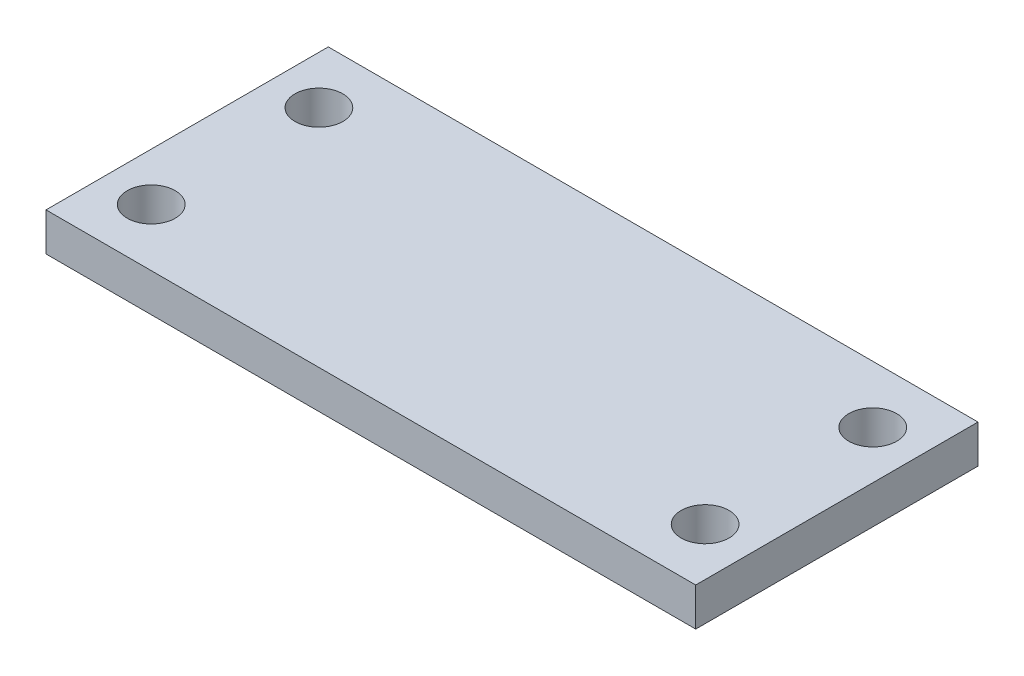
ISO-10303-21;
HEADER;
FILE_DESCRIPTION(('STEP AP214'),'2;1');
FILE_NAME('part.step','',(''),(''),'','','');
FILE_SCHEMA(('AUTOMOTIVE_DESIGN { 1 0 10303 214 1 1 1 1 }'));
ENDSEC;
DATA;
#1=APPLICATION_CONTEXT('core data for automotive mechanical design processes');
#2=APPLICATION_PROTOCOL_DEFINITION('international standard','automotive_design',2000,#1);
#3=PRODUCT_CONTEXT('',#1,'mechanical');
#4=PRODUCT('Part','Part','',(#3));
#5=PRODUCT_RELATED_PRODUCT_CATEGORY('part','',(#4));
#6=PRODUCT_DEFINITION_FORMATION('','',#4);
#7=PRODUCT_DEFINITION_CONTEXT('part definition',#1,'design');
#8=PRODUCT_DEFINITION('design','',#6,#7);
#9=PRODUCT_DEFINITION_SHAPE('','',#8);
#10=(LENGTH_UNIT() NAMED_UNIT(*) SI_UNIT(.MILLI.,.METRE.));
#11=(NAMED_UNIT(*) PLANE_ANGLE_UNIT() SI_UNIT($,.RADIAN.));
#12=(NAMED_UNIT(*) SI_UNIT($,.STERADIAN.) SOLID_ANGLE_UNIT());
#13=UNCERTAINTY_MEASURE_WITH_UNIT(LENGTH_MEASURE(1.E-05),#10,'distance_accuracy_value','');
#14=(GEOMETRIC_REPRESENTATION_CONTEXT(3) GLOBAL_UNCERTAINTY_ASSIGNED_CONTEXT((#13)) GLOBAL_UNIT_ASSIGNED_CONTEXT((#10,
#11,#12)) REPRESENTATION_CONTEXT('',''));
#15=CARTESIAN_POINT('',(0.,0.,0.));
#16=DIRECTION('',(0.,0.,1.));
#17=DIRECTION('',(1.,0.,0.));
#18=AXIS2_PLACEMENT_3D('',#15,#16,#17);
#19=CARTESIAN_POINT('',(0.,3.9878,0.));
#20=DIRECTION('',(0.,-1.,0.));
#21=DIRECTION('',(0.,0.,-1.));
#22=AXIS2_PLACEMENT_3D('',#19,#20,#21);
#23=PLANE('',#22);
#24=DIRECTION('',(1.,0.,0.));
#25=VECTOR('',#24,1.);
#26=CARTESIAN_POINT('',(67.818,3.9878,0.));
#27=LINE('',#26,#25);
#28=CARTESIAN_POINT('',(0.,3.9878,0.));
#29=VERTEX_POINT('',#28);
#30=CARTESIAN_POINT('',(67.818,3.9878,0.));
#31=VERTEX_POINT('',#30);
#32=EDGE_CURVE('E85',#29,#31,#27,.T.);
#33=ORIENTED_EDGE('',*,*,#32,.T.);
#34=DIRECTION('',(0.,0.,-1.));
#35=VECTOR('',#34,1.);
#36=CARTESIAN_POINT('',(67.818,3.9878,-29.464));
#37=LINE('',#36,#35);
#38=CARTESIAN_POINT('',(67.818,3.9878,-29.464));
#39=VERTEX_POINT('',#38);
#40=EDGE_CURVE('E80',#31,#39,#37,.T.);
#41=ORIENTED_EDGE('',*,*,#40,.T.);
#42=DIRECTION('',(-1.,0.,0.));
#43=VECTOR('',#42,1.);
#44=CARTESIAN_POINT('',(0.,3.9878,-29.464));
#45=LINE('',#44,#43);
#46=CARTESIAN_POINT('',(0.,3.9878,-29.464));
#47=VERTEX_POINT('',#46);
#48=EDGE_CURVE('E83',#39,#47,#45,.T.);
#49=ORIENTED_EDGE('',*,*,#48,.T.);
#50=DIRECTION('',(0.,0.,1.));
#51=VECTOR('',#50,1.);
#52=CARTESIAN_POINT('',(0.,3.9878,0.));
#53=LINE('',#52,#51);
#54=EDGE_CURVE('E50',#47,#29,#53,.T.);
#55=ORIENTED_EDGE('',*,*,#54,.T.);
#56=EDGE_LOOP('',(#33,#41,#49,#55));
#57=FACE_BOUND('',#56,.T.);
#58=CARTESIAN_POINT('',(5.0038,3.9878,-23.4823));
#59=DIRECTION('',(0.,1.,0.));
#60=DIRECTION('',(0.,0.,1.));
#61=AXIS2_PLACEMENT_3D('',#58,#59,#60);
#62=CIRCLE('',#61,2.5019);
#63=CARTESIAN_POINT('',(5.0038,3.9878,-20.9804));
#64=VERTEX_POINT('',#63);
#65=EDGE_CURVE('E100',#64,#64,#62,.T.);
#66=ORIENTED_EDGE('',*,*,#65,.F.);
#67=EDGE_LOOP('',(#66));
#68=FACE_BOUND('',#67,.T.);
#69=CARTESIAN_POINT('',(62.8142,3.9878,-23.4823));
#70=DIRECTION('',(0.,1.,0.));
#71=DIRECTION('',(0.,0.,-1.));
#72=AXIS2_PLACEMENT_3D('',#69,#70,#71);
#73=CIRCLE('',#72,2.50189999999999);
#74=CARTESIAN_POINT('',(62.8142,3.9878,-25.9842));
#75=VERTEX_POINT('',#74);
#76=EDGE_CURVE('E115',#75,#75,#73,.T.);
#77=ORIENTED_EDGE('',*,*,#76,.F.);
#78=EDGE_LOOP('',(#77));
#79=FACE_BOUND('',#78,.T.);
#80=CARTESIAN_POINT('',(62.8142,3.9878,-5.9817));
#81=DIRECTION('',(0.,1.,0.));
#82=DIRECTION('',(0.,0.,1.));
#83=AXIS2_PLACEMENT_3D('',#80,#81,#82);
#84=CIRCLE('',#83,2.50189999999999);
#85=CARTESIAN_POINT('',(62.8142,3.9878,-3.47980000000001));
#86=VERTEX_POINT('',#85);
#87=EDGE_CURVE('E121',#86,#86,#84,.T.);
#88=ORIENTED_EDGE('',*,*,#87,.F.);
#89=EDGE_LOOP('',(#88));
#90=FACE_BOUND('',#89,.T.);
#91=CARTESIAN_POINT('',(5.0038,3.9878,-5.9817));
#92=DIRECTION('',(0.,1.,0.));
#93=DIRECTION('',(0.,0.,-1.));
#94=AXIS2_PLACEMENT_3D('',#91,#92,#93);
#95=CIRCLE('',#94,2.5019);
#96=CARTESIAN_POINT('',(5.0038,3.9878,-8.4836));
#97=VERTEX_POINT('',#96);
#98=EDGE_CURVE('E127',#97,#97,#95,.T.);
#99=ORIENTED_EDGE('',*,*,#98,.F.);
#100=EDGE_LOOP('',(#99));
#101=FACE_BOUND('',#100,.T.);
#102=ADVANCED_FACE('F33',(#57,#68,#79,#90,#101),#23,.F.);
#103=CARTESIAN_POINT('',(0.,0.,0.));
#104=DIRECTION('',(0.,-1.,0.));
#105=DIRECTION('',(0.,0.,-1.));
#106=AXIS2_PLACEMENT_3D('',#103,#104,#105);
#107=PLANE('',#106);
#108=CARTESIAN_POINT('',(62.8142,0.,-5.9817));
#109=DIRECTION('',(0.,1.,0.));
#110=DIRECTION('',(0.,0.,1.));
#111=AXIS2_PLACEMENT_3D('',#108,#109,#110);
#112=CIRCLE('',#111,2.50189999999999);
#113=CARTESIAN_POINT('',(62.8142,0.,-3.47980000000001));
#114=VERTEX_POINT('',#113);
#115=EDGE_CURVE('E124',#114,#114,#112,.T.);
#116=ORIENTED_EDGE('',*,*,#115,.T.);
#117=EDGE_LOOP('',(#116));
#118=FACE_BOUND('',#117,.T.);
#119=CARTESIAN_POINT('',(5.0038,0.,-23.4823));
#120=DIRECTION('',(0.,1.,0.));
#121=DIRECTION('',(0.,0.,1.));
#122=AXIS2_PLACEMENT_3D('',#119,#120,#121);
#123=CIRCLE('',#122,2.5019);
#124=CARTESIAN_POINT('',(5.0038,0.,-20.9804));
#125=VERTEX_POINT('',#124);
#126=EDGE_CURVE('E112',#125,#125,#123,.T.);
#127=ORIENTED_EDGE('',*,*,#126,.T.);
#128=EDGE_LOOP('',(#127));
#129=FACE_BOUND('',#128,.T.);
#130=DIRECTION('',(1.,0.,0.));
#131=VECTOR('',#130,1.);
#132=CARTESIAN_POINT('',(67.818,0.,0.));
#133=LINE('',#132,#131);
#134=CARTESIAN_POINT('',(0.,0.,0.));
#135=VERTEX_POINT('',#134);
#136=CARTESIAN_POINT('',(67.818,0.,0.));
#137=VERTEX_POINT('',#136);
#138=EDGE_CURVE('E97',#135,#137,#133,.T.);
#139=ORIENTED_EDGE('',*,*,#138,.F.);
#140=DIRECTION('',(0.,0.,1.));
#141=VECTOR('',#140,1.);
#142=CARTESIAN_POINT('',(0.,0.,0.));
#143=LINE('',#142,#141);
#144=CARTESIAN_POINT('',(0.,0.,-29.464));
#145=VERTEX_POINT('',#144);
#146=EDGE_CURVE('E73',#145,#135,#143,.T.);
#147=ORIENTED_EDGE('',*,*,#146,.F.);
#148=DIRECTION('',(-1.,0.,0.));
#149=VECTOR('',#148,1.);
#150=CARTESIAN_POINT('',(0.,0.,-29.464));
#151=LINE('',#150,#149);
#152=CARTESIAN_POINT('',(67.818,0.,-29.464));
#153=VERTEX_POINT('',#152);
#154=EDGE_CURVE('E67',#153,#145,#151,.T.);
#155=ORIENTED_EDGE('',*,*,#154,.F.);
#156=DIRECTION('',(0.,0.,-1.));
#157=VECTOR('',#156,1.);
#158=CARTESIAN_POINT('',(67.818,0.,-29.464));
#159=LINE('',#158,#157);
#160=EDGE_CURVE('E89',#137,#153,#159,.T.);
#161=ORIENTED_EDGE('',*,*,#160,.F.);
#162=EDGE_LOOP('',(#139,#147,#155,#161));
#163=FACE_BOUND('',#162,.T.);
#164=CARTESIAN_POINT('',(62.8142,0.,-23.4823));
#165=DIRECTION('',(0.,1.,0.));
#166=DIRECTION('',(0.,0.,-1.));
#167=AXIS2_PLACEMENT_3D('',#164,#165,#166);
#168=CIRCLE('',#167,2.50189999999999);
#169=CARTESIAN_POINT('',(62.8142,0.,-25.9842));
#170=VERTEX_POINT('',#169);
#171=EDGE_CURVE('E118',#170,#170,#168,.T.);
#172=ORIENTED_EDGE('',*,*,#171,.T.);
#173=EDGE_LOOP('',(#172));
#174=FACE_BOUND('',#173,.T.);
#175=CARTESIAN_POINT('',(5.0038,0.,-5.9817));
#176=DIRECTION('',(0.,1.,0.));
#177=DIRECTION('',(0.,0.,-1.));
#178=AXIS2_PLACEMENT_3D('',#175,#176,#177);
#179=CIRCLE('',#178,2.5019);
#180=CARTESIAN_POINT('',(5.0038,0.,-8.4836));
#181=VERTEX_POINT('',#180);
#182=EDGE_CURVE('E130',#181,#181,#179,.T.);
#183=ORIENTED_EDGE('',*,*,#182,.T.);
#184=EDGE_LOOP('',(#183));
#185=FACE_BOUND('',#184,.T.);
#186=ADVANCED_FACE('F108',(#118,#129,#163,#174,#185),#107,.T.);
#187=CARTESIAN_POINT('',(67.818,3.9878,0.));
#188=DIRECTION('',(0.,0.,-1.));
#189=DIRECTION('',(-1.,0.,0.));
#190=AXIS2_PLACEMENT_3D('',#187,#188,#189);
#191=PLANE('',#190);
#192=ORIENTED_EDGE('',*,*,#138,.T.);
#193=DIRECTION('',(0.,-1.,0.));
#194=VECTOR('',#193,1.);
#195=CARTESIAN_POINT('',(67.818,3.9878,0.));
#196=LINE('',#195,#194);
#197=EDGE_CURVE('E11',#31,#137,#196,.T.);
#198=ORIENTED_EDGE('',*,*,#197,.F.);
#199=ORIENTED_EDGE('',*,*,#32,.F.);
#200=DIRECTION('',(0.,-1.,0.));
#201=VECTOR('',#200,1.);
#202=CARTESIAN_POINT('',(0.,3.9878,0.));
#203=LINE('',#202,#201);
#204=EDGE_CURVE('E93',#29,#135,#203,.T.);
#205=ORIENTED_EDGE('',*,*,#204,.T.);
#206=EDGE_LOOP('',(#192,#198,#199,#205));
#207=FACE_BOUND('',#206,.T.);
#208=ADVANCED_FACE('F35',(#207),#191,.F.);
#209=CARTESIAN_POINT('',(67.818,3.9878,-29.464));
#210=DIRECTION('',(-1.,0.,0.));
#211=DIRECTION('',(0.,0.,1.));
#212=AXIS2_PLACEMENT_3D('',#209,#210,#211);
#213=PLANE('',#212);
#214=ORIENTED_EDGE('',*,*,#160,.T.);
#215=DIRECTION('',(0.,-1.,0.));
#216=VECTOR('',#215,1.);
#217=CARTESIAN_POINT('',(67.818,3.9878,-29.464));
#218=LINE('',#217,#216);
#219=EDGE_CURVE('E42',#39,#153,#218,.T.);
#220=ORIENTED_EDGE('',*,*,#219,.F.);
#221=ORIENTED_EDGE('',*,*,#40,.F.);
#222=ORIENTED_EDGE('',*,*,#197,.T.);
#223=EDGE_LOOP('',(#214,#220,#221,#222));
#224=FACE_BOUND('',#223,.T.);
#225=ADVANCED_FACE('F88',(#224),#213,.F.);
#226=CARTESIAN_POINT('',(0.,3.9878,-29.464));
#227=DIRECTION('',(0.,0.,1.));
#228=DIRECTION('',(1.,0.,0.));
#229=AXIS2_PLACEMENT_3D('',#226,#227,#228);
#230=PLANE('',#229);
#231=ORIENTED_EDGE('',*,*,#154,.T.);
#232=DIRECTION('',(0.,-1.,0.));
#233=VECTOR('',#232,1.);
#234=CARTESIAN_POINT('',(0.,3.9878,-29.464));
#235=LINE('',#234,#233);
#236=EDGE_CURVE('E90',#47,#145,#235,.T.);
#237=ORIENTED_EDGE('',*,*,#236,.F.);
#238=ORIENTED_EDGE('',*,*,#48,.F.);
#239=ORIENTED_EDGE('',*,*,#219,.T.);
#240=EDGE_LOOP('',(#231,#237,#238,#239));
#241=FACE_BOUND('',#240,.T.);
#242=ADVANCED_FACE('F91',(#241),#230,.F.);
#243=CARTESIAN_POINT('',(0.,3.9878,0.));
#244=DIRECTION('',(1.,0.,0.));
#245=DIRECTION('',(0.,0.,-1.));
#246=AXIS2_PLACEMENT_3D('',#243,#244,#245);
#247=PLANE('',#246);
#248=ORIENTED_EDGE('',*,*,#146,.T.);
#249=ORIENTED_EDGE('',*,*,#204,.F.);
#250=ORIENTED_EDGE('',*,*,#54,.F.);
#251=ORIENTED_EDGE('',*,*,#236,.T.);
#252=EDGE_LOOP('',(#248,#249,#250,#251));
#253=FACE_BOUND('',#252,.T.);
#254=ADVANCED_FACE('F105',(#253),#247,.F.);
#255=CARTESIAN_POINT('',(5.0038,3.9878,-23.4823));
#256=DIRECTION('',(0.,-1.,0.));
#257=DIRECTION('',(0.,0.,-1.));
#258=AXIS2_PLACEMENT_3D('',#255,#256,#257);
#259=CYLINDRICAL_SURFACE('',#258,2.5019);
#260=ORIENTED_EDGE('',*,*,#65,.T.);
#261=EDGE_LOOP('',(#260));
#262=FACE_BOUND('',#261,.T.);
#263=ORIENTED_EDGE('',*,*,#126,.F.);
#264=EDGE_LOOP('',(#263));
#265=FACE_BOUND('',#264,.T.);
#266=ADVANCED_FACE('F147',(#262,#265),#259,.F.);
#267=CARTESIAN_POINT('',(62.8142,3.9878,-23.4823));
#268=DIRECTION('',(0.,-1.,0.));
#269=DIRECTION('',(0.,0.,-1.));
#270=AXIS2_PLACEMENT_3D('',#267,#268,#269);
#271=CYLINDRICAL_SURFACE('',#270,2.50189999999999);
#272=ORIENTED_EDGE('',*,*,#76,.T.);
#273=EDGE_LOOP('',(#272));
#274=FACE_BOUND('',#273,.T.);
#275=ORIENTED_EDGE('',*,*,#171,.F.);
#276=EDGE_LOOP('',(#275));
#277=FACE_BOUND('',#276,.T.);
#278=ADVANCED_FACE('F193',(#274,#277),#271,.F.);
#279=CARTESIAN_POINT('',(62.8142,3.9878,-5.9817));
#280=DIRECTION('',(0.,-1.,0.));
#281=DIRECTION('',(0.,0.,-1.));
#282=AXIS2_PLACEMENT_3D('',#279,#280,#281);
#283=CYLINDRICAL_SURFACE('',#282,2.50189999999999);
#284=ORIENTED_EDGE('',*,*,#87,.T.);
#285=EDGE_LOOP('',(#284));
#286=FACE_BOUND('',#285,.T.);
#287=ORIENTED_EDGE('',*,*,#115,.F.);
#288=EDGE_LOOP('',(#287));
#289=FACE_BOUND('',#288,.T.);
#290=ADVANCED_FACE('F201',(#286,#289),#283,.F.);
#291=CARTESIAN_POINT('',(5.0038,3.9878,-5.9817));
#292=DIRECTION('',(0.,-1.,0.));
#293=DIRECTION('',(0.,0.,-1.));
#294=AXIS2_PLACEMENT_3D('',#291,#292,#293);
#295=CYLINDRICAL_SURFACE('',#294,2.5019);
#296=ORIENTED_EDGE('',*,*,#98,.T.);
#297=EDGE_LOOP('',(#296));
#298=FACE_BOUND('',#297,.T.);
#299=ORIENTED_EDGE('',*,*,#182,.F.);
#300=EDGE_LOOP('',(#299));
#301=FACE_BOUND('',#300,.T.);
#302=ADVANCED_FACE('F136',(#298,#301),#295,.F.);
#303=CLOSED_SHELL('',(#102,#186,#208,#225,#242,#254,#266,#278,#290,#302));
#304=MANIFOLD_SOLID_BREP('B2',#303);
#305=ADVANCED_BREP_SHAPE_REPRESENTATION('',(#18,#304),#14);
#306=SHAPE_DEFINITION_REPRESENTATION(#9,#305);
ENDSEC;
END-ISO-10303-21;
